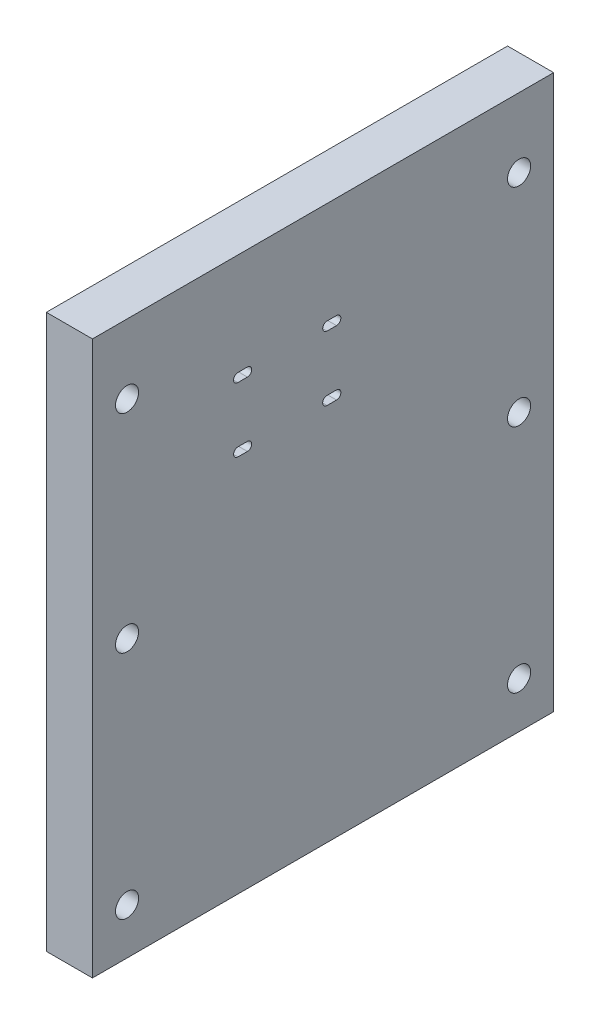
ISO-10303-21;
HEADER;
FILE_DESCRIPTION(('STEP AP214'),'2;1');
FILE_NAME('part.step','',(''),(''),'','','');
FILE_SCHEMA(('AUTOMOTIVE_DESIGN { 1 0 10303 214 1 1 1 1 }'));
ENDSEC;
DATA;
#1=APPLICATION_CONTEXT('core data for automotive mechanical design processes');
#2=APPLICATION_PROTOCOL_DEFINITION('international standard','automotive_design',2000,#1);
#3=PRODUCT_CONTEXT('',#1,'mechanical');
#4=PRODUCT('Part','Part','',(#3));
#5=PRODUCT_RELATED_PRODUCT_CATEGORY('part','',(#4));
#6=PRODUCT_DEFINITION_FORMATION('','',#4);
#7=PRODUCT_DEFINITION_CONTEXT('part definition',#1,'design');
#8=PRODUCT_DEFINITION('design','',#6,#7);
#9=PRODUCT_DEFINITION_SHAPE('','',#8);
#10=(LENGTH_UNIT() NAMED_UNIT(*) SI_UNIT(.MILLI.,.METRE.));
#11=(NAMED_UNIT(*) PLANE_ANGLE_UNIT() SI_UNIT($,.RADIAN.));
#12=(NAMED_UNIT(*) SI_UNIT($,.STERADIAN.) SOLID_ANGLE_UNIT());
#13=UNCERTAINTY_MEASURE_WITH_UNIT(LENGTH_MEASURE(1.E-05),#10,'distance_accuracy_value','');
#14=(GEOMETRIC_REPRESENTATION_CONTEXT(3) GLOBAL_UNCERTAINTY_ASSIGNED_CONTEXT((#13)) GLOBAL_UNIT_ASSIGNED_CONTEXT((#10,
#11,#12)) REPRESENTATION_CONTEXT('',''));
#15=CARTESIAN_POINT('',(0.,0.,0.));
#16=DIRECTION('',(0.,0.,1.));
#17=DIRECTION('',(1.,0.,0.));
#18=AXIS2_PLACEMENT_3D('',#15,#16,#17);
#19=CARTESIAN_POINT('',(12.7,46.97,-39.2012106466433));
#20=DIRECTION('',(-1.,0.,0.));
#21=DIRECTION('',(0.,0.,1.));
#22=AXIS2_PLACEMENT_3D('',#19,#20,#21);
#23=CYLINDRICAL_SURFACE('',#22,1.2);
#24=CARTESIAN_POINT('',(0.,46.97,-39.2012106466433));
#25=DIRECTION('',(1.,0.,0.));
#26=DIRECTION('',(0.,0.,-1.));
#27=AXIS2_PLACEMENT_3D('',#24,#25,#26);
#28=CIRCLE('',#27,1.2);
#29=CARTESIAN_POINT('',(0.,48.17,-39.2012106466433));
#30=VERTEX_POINT('',#29);
#31=CARTESIAN_POINT('',(0.,45.77,-39.2012106466433));
#32=VERTEX_POINT('',#31);
#33=EDGE_CURVE('E309',#30,#32,#28,.T.);
#34=ORIENTED_EDGE('',*,*,#33,.F.);
#35=DIRECTION('',(-1.,0.,0.));
#36=VECTOR('',#35,1.);
#37=CARTESIAN_POINT('',(12.7,48.17,-39.2012106466433));
#38=LINE('',#37,#36);
#39=CARTESIAN_POINT('',(12.7,48.17,-39.2012106466433));
#40=VERTEX_POINT('',#39);
#41=EDGE_CURVE('E11',#40,#30,#38,.T.);
#42=ORIENTED_EDGE('',*,*,#41,.F.);
#43=CARTESIAN_POINT('',(12.7,46.97,-39.2012106466433));
#44=DIRECTION('',(1.,0.,0.));
#45=DIRECTION('',(0.,0.,-1.));
#46=AXIS2_PLACEMENT_3D('',#43,#44,#45);
#47=CIRCLE('',#46,1.2);
#48=CARTESIAN_POINT('',(12.7,45.77,-39.2012106466433));
#49=VERTEX_POINT('',#48);
#50=EDGE_CURVE('E212',#40,#49,#47,.T.);
#51=ORIENTED_EDGE('',*,*,#50,.T.);
#52=DIRECTION('',(-1.,0.,0.));
#53=VECTOR('',#52,1.);
#54=CARTESIAN_POINT('',(12.7,45.77,-39.2012106466433));
#55=LINE('',#54,#53);
#56=EDGE_CURVE('E139',#49,#32,#55,.T.);
#57=ORIENTED_EDGE('',*,*,#56,.T.);
#58=EDGE_LOOP('',(#34,#42,#51,#57));
#59=FACE_BOUND('',#58,.T.);
#60=ADVANCED_FACE('F49',(#59),#23,.F.);
#61=CARTESIAN_POINT('',(12.7,48.17,0.));
#62=DIRECTION('',(0.,-1.,0.));
#63=DIRECTION('',(0.,0.,-1.));
#64=AXIS2_PLACEMENT_3D('',#61,#62,#63);
#65=PLANE('',#64);
#66=DIRECTION('',(0.,0.,1.));
#67=VECTOR('',#66,1.);
#68=CARTESIAN_POINT('',(0.,48.17,0.));
#69=LINE('',#68,#67);
#70=CARTESIAN_POINT('',(0.,48.17,-41.8012106466433));
#71=VERTEX_POINT('',#70);
#72=EDGE_CURVE('E203',#71,#30,#69,.T.);
#73=ORIENTED_EDGE('',*,*,#72,.F.);
#74=DIRECTION('',(-1.,0.,0.));
#75=VECTOR('',#74,1.);
#76=CARTESIAN_POINT('',(12.7,48.17,-41.8012106466433));
#77=LINE('',#76,#75);
#78=CARTESIAN_POINT('',(12.7,48.17,-41.8012106466433));
#79=VERTEX_POINT('',#78);
#80=EDGE_CURVE('E60',#79,#71,#77,.T.);
#81=ORIENTED_EDGE('',*,*,#80,.F.);
#82=DIRECTION('',(0.,0.,1.));
#83=VECTOR('',#82,1.);
#84=CARTESIAN_POINT('',(12.7,48.17,0.));
#85=LINE('',#84,#83);
#86=EDGE_CURVE('E201',#79,#40,#85,.T.);
#87=ORIENTED_EDGE('',*,*,#86,.T.);
#88=ORIENTED_EDGE('',*,*,#41,.T.);
#89=EDGE_LOOP('',(#73,#81,#87,#88));
#90=FACE_BOUND('',#89,.T.);
#91=ADVANCED_FACE('F200',(#90),#65,.T.);
#92=CARTESIAN_POINT('',(12.7,46.97,-41.8012106466433));
#93=DIRECTION('',(-1.,0.,0.));
#94=DIRECTION('',(0.,0.,1.));
#95=AXIS2_PLACEMENT_3D('',#92,#93,#94);
#96=CYLINDRICAL_SURFACE('',#95,1.2);
#97=CARTESIAN_POINT('',(0.,46.97,-41.8012106466433));
#98=DIRECTION('',(1.,0.,0.));
#99=DIRECTION('',(0.,0.,-1.));
#100=AXIS2_PLACEMENT_3D('',#97,#98,#99);
#101=CIRCLE('',#100,1.2);
#102=CARTESIAN_POINT('',(0.,45.77,-41.8012106466433));
#103=VERTEX_POINT('',#102);
#104=EDGE_CURVE('E315',#103,#71,#101,.T.);
#105=ORIENTED_EDGE('',*,*,#104,.F.);
#106=DIRECTION('',(-1.,0.,0.));
#107=VECTOR('',#106,1.);
#108=CARTESIAN_POINT('',(12.7,45.77,-41.8012106466433));
#109=LINE('',#108,#107);
#110=CARTESIAN_POINT('',(12.7,45.77,-41.8012106466433));
#111=VERTEX_POINT('',#110);
#112=EDGE_CURVE('E132',#111,#103,#109,.T.);
#113=ORIENTED_EDGE('',*,*,#112,.F.);
#114=CARTESIAN_POINT('',(12.7,46.97,-41.8012106466433));
#115=DIRECTION('',(1.,0.,0.));
#116=DIRECTION('',(0.,0.,-1.));
#117=AXIS2_PLACEMENT_3D('',#114,#115,#116);
#118=CIRCLE('',#117,1.2);
#119=EDGE_CURVE('E211',#111,#79,#118,.T.);
#120=ORIENTED_EDGE('',*,*,#119,.T.);
#121=ORIENTED_EDGE('',*,*,#80,.T.);
#122=EDGE_LOOP('',(#105,#113,#120,#121));
#123=FACE_BOUND('',#122,.T.);
#124=ADVANCED_FACE('F215',(#123),#96,.F.);
#125=CARTESIAN_POINT('',(12.7,30.43,0.));
#126=DIRECTION('',(0.,-1.,0.));
#127=DIRECTION('',(0.,0.,-1.));
#128=AXIS2_PLACEMENT_3D('',#125,#126,#127);
#129=PLANE('',#128);
#130=DIRECTION('',(0.,0.,1.));
#131=VECTOR('',#130,1.);
#132=CARTESIAN_POINT('',(0.,30.43,0.));
#133=LINE('',#132,#131);
#134=CARTESIAN_POINT('',(0.,30.43,-41.8012106466433));
#135=VERTEX_POINT('',#134);
#136=CARTESIAN_POINT('',(0.,30.43,-39.2012106466433));
#137=VERTEX_POINT('',#136);
#138=EDGE_CURVE('E293',#135,#137,#133,.T.);
#139=ORIENTED_EDGE('',*,*,#138,.F.);
#140=DIRECTION('',(-1.,0.,0.));
#141=VECTOR('',#140,1.);
#142=CARTESIAN_POINT('',(12.7,30.43,-41.8012106466433));
#143=LINE('',#142,#141);
#144=CARTESIAN_POINT('',(12.7,30.43,-41.8012106466433));
#145=VERTEX_POINT('',#144);
#146=EDGE_CURVE('E324',#145,#135,#143,.T.);
#147=ORIENTED_EDGE('',*,*,#146,.F.);
#148=DIRECTION('',(0.,0.,1.));
#149=VECTOR('',#148,1.);
#150=CARTESIAN_POINT('',(12.7,30.43,0.));
#151=LINE('',#150,#149);
#152=CARTESIAN_POINT('',(12.7,30.43,-39.2012106466433));
#153=VERTEX_POINT('',#152);
#154=EDGE_CURVE('E434',#145,#153,#151,.T.);
#155=ORIENTED_EDGE('',*,*,#154,.T.);
#156=DIRECTION('',(-1.,0.,0.));
#157=VECTOR('',#156,1.);
#158=CARTESIAN_POINT('',(12.7,30.43,-39.2012106466433));
#159=LINE('',#158,#157);
#160=EDGE_CURVE('E327',#153,#137,#159,.T.);
#161=ORIENTED_EDGE('',*,*,#160,.T.);
#162=EDGE_LOOP('',(#139,#147,#155,#161));
#163=FACE_BOUND('',#162,.T.);
#164=ADVANCED_FACE('F484',(#163),#129,.T.);
#165=CARTESIAN_POINT('',(12.7,29.23,-41.8012106466433));
#166=DIRECTION('',(-1.,0.,0.));
#167=DIRECTION('',(0.,0.,1.));
#168=AXIS2_PLACEMENT_3D('',#165,#166,#167);
#169=CYLINDRICAL_SURFACE('',#168,1.2);
#170=CARTESIAN_POINT('',(0.,29.23,-41.8012106466433));
#171=DIRECTION('',(1.,0.,0.));
#172=DIRECTION('',(0.,0.,-1.));
#173=AXIS2_PLACEMENT_3D('',#170,#171,#172);
#174=CIRCLE('',#173,1.2);
#175=CARTESIAN_POINT('',(0.,28.03,-41.8012106466433));
#176=VERTEX_POINT('',#175);
#177=EDGE_CURVE('E297',#135,#176,#174,.F.);
#178=ORIENTED_EDGE('',*,*,#177,.T.);
#179=DIRECTION('',(-1.,0.,0.));
#180=VECTOR('',#179,1.);
#181=CARTESIAN_POINT('',(12.7,28.03,-41.8012106466433));
#182=LINE('',#181,#180);
#183=CARTESIAN_POINT('',(12.7,28.03,-41.8012106466433));
#184=VERTEX_POINT('',#183);
#185=EDGE_CURVE('E335',#184,#176,#182,.T.);
#186=ORIENTED_EDGE('',*,*,#185,.F.);
#187=CARTESIAN_POINT('',(12.7,29.23,-41.8012106466433));
#188=DIRECTION('',(1.,0.,0.));
#189=DIRECTION('',(0.,0.,-1.));
#190=AXIS2_PLACEMENT_3D('',#187,#188,#189);
#191=CIRCLE('',#190,1.2);
#192=EDGE_CURVE('E438',#145,#184,#191,.F.);
#193=ORIENTED_EDGE('',*,*,#192,.F.);
#194=ORIENTED_EDGE('',*,*,#146,.T.);
#195=EDGE_LOOP('',(#178,#186,#193,#194));
#196=FACE_BOUND('',#195,.T.);
#197=ADVANCED_FACE('F480',(#196),#169,.F.);
#198=CARTESIAN_POINT('',(12.7,28.03,0.));
#199=DIRECTION('',(0.,-1.,0.));
#200=DIRECTION('',(0.,0.,-1.));
#201=AXIS2_PLACEMENT_3D('',#198,#199,#200);
#202=PLANE('',#201);
#203=DIRECTION('',(0.,0.,1.));
#204=VECTOR('',#203,1.);
#205=CARTESIAN_POINT('',(0.,28.03,0.));
#206=LINE('',#205,#204);
#207=CARTESIAN_POINT('',(0.,28.03,-39.2012106466433));
#208=VERTEX_POINT('',#207);
#209=EDGE_CURVE('E301',#176,#208,#206,.T.);
#210=ORIENTED_EDGE('',*,*,#209,.T.);
#211=DIRECTION('',(-1.,0.,0.));
#212=VECTOR('',#211,1.);
#213=CARTESIAN_POINT('',(12.7,28.03,-39.2012106466433));
#214=LINE('',#213,#212);
#215=CARTESIAN_POINT('',(12.7,28.03,-39.2012106466433));
#216=VERTEX_POINT('',#215);
#217=EDGE_CURVE('E330',#216,#208,#214,.T.);
#218=ORIENTED_EDGE('',*,*,#217,.F.);
#219=DIRECTION('',(0.,0.,1.));
#220=VECTOR('',#219,1.);
#221=CARTESIAN_POINT('',(12.7,28.03,0.));
#222=LINE('',#221,#220);
#223=EDGE_CURVE('E442',#184,#216,#222,.T.);
#224=ORIENTED_EDGE('',*,*,#223,.F.);
#225=ORIENTED_EDGE('',*,*,#185,.T.);
#226=EDGE_LOOP('',(#210,#218,#224,#225));
#227=FACE_BOUND('',#226,.T.);
#228=ADVANCED_FACE('F476',(#227),#202,.F.);
#229=CARTESIAN_POINT('',(12.7,45.77,0.));
#230=DIRECTION('',(0.,1.,0.));
#231=DIRECTION('',(0.,0.,1.));
#232=AXIS2_PLACEMENT_3D('',#229,#230,#231);
#233=PLANE('',#232);
#234=DIRECTION('',(0.,0.,-1.));
#235=VECTOR('',#234,1.);
#236=CARTESIAN_POINT('',(0.,45.77,0.));
#237=LINE('',#236,#235);
#238=CARTESIAN_POINT('',(0.,45.77,-14.6612106466434));
#239=VERTEX_POINT('',#238);
#240=CARTESIAN_POINT('',(0.,45.77,-17.2612106466434));
#241=VERTEX_POINT('',#240);
#242=EDGE_CURVE('E277',#239,#241,#237,.T.);
#243=ORIENTED_EDGE('',*,*,#242,.F.);
#244=DIRECTION('',(-1.,0.,0.));
#245=VECTOR('',#244,1.);
#246=CARTESIAN_POINT('',(12.7,45.77,-14.6612106466434));
#247=LINE('',#246,#245);
#248=CARTESIAN_POINT('',(12.7,45.77,-14.6612106466434));
#249=VERTEX_POINT('',#248);
#250=EDGE_CURVE('E331',#249,#239,#247,.T.);
#251=ORIENTED_EDGE('',*,*,#250,.F.);
#252=DIRECTION('',(0.,0.,-1.));
#253=VECTOR('',#252,1.);
#254=CARTESIAN_POINT('',(12.7,45.77,0.));
#255=LINE('',#254,#253);
#256=CARTESIAN_POINT('',(12.7,45.77,-17.2612106466434));
#257=VERTEX_POINT('',#256);
#258=EDGE_CURVE('E419',#249,#257,#255,.T.);
#259=ORIENTED_EDGE('',*,*,#258,.T.);
#260=DIRECTION('',(-1.,0.,0.));
#261=VECTOR('',#260,1.);
#262=CARTESIAN_POINT('',(12.7,45.77,-17.2612106466434));
#263=LINE('',#262,#261);
#264=EDGE_CURVE('E341',#257,#241,#263,.T.);
#265=ORIENTED_EDGE('',*,*,#264,.T.);
#266=EDGE_LOOP('',(#243,#251,#259,#265));
#267=FACE_BOUND('',#266,.T.);
#268=ADVANCED_FACE('F479',(#267),#233,.T.);
#269=CARTESIAN_POINT('',(12.7,46.97,-14.6612106466434));
#270=DIRECTION('',(-1.,0.,0.));
#271=DIRECTION('',(0.,0.,1.));
#272=AXIS2_PLACEMENT_3D('',#269,#270,#271);
#273=CYLINDRICAL_SURFACE('',#272,1.2);
#274=CARTESIAN_POINT('',(0.,46.97,-14.6612106466434));
#275=DIRECTION('',(1.,0.,0.));
#276=DIRECTION('',(0.,0.,-1.));
#277=AXIS2_PLACEMENT_3D('',#274,#275,#276);
#278=CIRCLE('',#277,1.2);
#279=CARTESIAN_POINT('',(0.,48.17,-14.6612106466434));
#280=VERTEX_POINT('',#279);
#281=EDGE_CURVE('E281',#239,#280,#278,.F.);
#282=ORIENTED_EDGE('',*,*,#281,.T.);
#283=DIRECTION('',(-1.,0.,0.));
#284=VECTOR('',#283,1.);
#285=CARTESIAN_POINT('',(12.7,48.17,-14.6612106466434));
#286=LINE('',#285,#284);
#287=CARTESIAN_POINT('',(12.7,48.17,-14.6612106466434));
#288=VERTEX_POINT('',#287);
#289=EDGE_CURVE('E349',#288,#280,#286,.T.);
#290=ORIENTED_EDGE('',*,*,#289,.F.);
#291=CARTESIAN_POINT('',(12.7,46.97,-14.6612106466434));
#292=DIRECTION('',(1.,0.,0.));
#293=DIRECTION('',(0.,0.,-1.));
#294=AXIS2_PLACEMENT_3D('',#291,#292,#293);
#295=CIRCLE('',#294,1.2);
#296=EDGE_CURVE('E423',#249,#288,#295,.F.);
#297=ORIENTED_EDGE('',*,*,#296,.F.);
#298=ORIENTED_EDGE('',*,*,#250,.T.);
#299=EDGE_LOOP('',(#282,#290,#297,#298));
#300=FACE_BOUND('',#299,.T.);
#301=ADVANCED_FACE('F497',(#300),#273,.F.);
#302=CARTESIAN_POINT('',(12.7,48.17,0.));
#303=DIRECTION('',(0.,1.,0.));
#304=DIRECTION('',(0.,0.,1.));
#305=AXIS2_PLACEMENT_3D('',#302,#303,#304);
#306=PLANE('',#305);
#307=DIRECTION('',(0.,0.,-1.));
#308=VECTOR('',#307,1.);
#309=CARTESIAN_POINT('',(0.,48.17,0.));
#310=LINE('',#309,#308);
#311=CARTESIAN_POINT('',(0.,48.17,-17.2612106466434));
#312=VERTEX_POINT('',#311);
#313=EDGE_CURVE('E285',#280,#312,#310,.T.);
#314=ORIENTED_EDGE('',*,*,#313,.T.);
#315=DIRECTION('',(-1.,0.,0.));
#316=VECTOR('',#315,1.);
#317=CARTESIAN_POINT('',(12.7,48.17,-17.2612106466434));
#318=LINE('',#317,#316);
#319=CARTESIAN_POINT('',(12.7,48.17,-17.2612106466434));
#320=VERTEX_POINT('',#319);
#321=EDGE_CURVE('E344',#320,#312,#318,.T.);
#322=ORIENTED_EDGE('',*,*,#321,.F.);
#323=DIRECTION('',(0.,0.,-1.));
#324=VECTOR('',#323,1.);
#325=CARTESIAN_POINT('',(12.7,48.17,0.));
#326=LINE('',#325,#324);
#327=EDGE_CURVE('E427',#288,#320,#326,.T.);
#328=ORIENTED_EDGE('',*,*,#327,.F.);
#329=ORIENTED_EDGE('',*,*,#289,.T.);
#330=EDGE_LOOP('',(#314,#322,#328,#329));
#331=FACE_BOUND('',#330,.T.);
#332=ADVANCED_FACE('F493',(#331),#306,.F.);
#333=CARTESIAN_POINT('',(12.7,29.23,-17.2612106466435));
#334=DIRECTION('',(-1.,0.,0.));
#335=DIRECTION('',(0.,0.,1.));
#336=AXIS2_PLACEMENT_3D('',#333,#334,#335);
#337=CYLINDRICAL_SURFACE('',#336,1.2);
#338=CARTESIAN_POINT('',(0.,29.23,-17.2612106466435));
#339=DIRECTION('',(1.,0.,0.));
#340=DIRECTION('',(0.,0.,-1.));
#341=AXIS2_PLACEMENT_3D('',#338,#339,#340);
#342=CIRCLE('',#341,1.2);
#343=CARTESIAN_POINT('',(0.,28.03,-17.2612106466434));
#344=VERTEX_POINT('',#343);
#345=CARTESIAN_POINT('',(0.,30.43,-17.2612106466434));
#346=VERTEX_POINT('',#345);
#347=EDGE_CURVE('E261',#344,#346,#342,.T.);
#348=ORIENTED_EDGE('',*,*,#347,.F.);
#349=DIRECTION('',(-1.,0.,0.));
#350=VECTOR('',#349,1.);
#351=CARTESIAN_POINT('',(12.7,28.03,-17.2612106466434));
#352=LINE('',#351,#350);
#353=CARTESIAN_POINT('',(12.7,28.03,-17.2612106466434));
#354=VERTEX_POINT('',#353);
#355=EDGE_CURVE('E345',#354,#344,#352,.T.);
#356=ORIENTED_EDGE('',*,*,#355,.F.);
#357=CARTESIAN_POINT('',(12.7,29.23,-17.2612106466435));
#358=DIRECTION('',(1.,0.,0.));
#359=DIRECTION('',(0.,0.,-1.));
#360=AXIS2_PLACEMENT_3D('',#357,#358,#359);
#361=CIRCLE('',#360,1.2);
#362=CARTESIAN_POINT('',(12.7,30.43,-17.2612106466434));
#363=VERTEX_POINT('',#362);
#364=EDGE_CURVE('E398',#354,#363,#361,.T.);
#365=ORIENTED_EDGE('',*,*,#364,.T.);
#366=DIRECTION('',(-1.,0.,0.));
#367=VECTOR('',#366,1.);
#368=CARTESIAN_POINT('',(12.7,30.43,-17.2612106466434));
#369=LINE('',#368,#367);
#370=EDGE_CURVE('E355',#363,#346,#369,.T.);
#371=ORIENTED_EDGE('',*,*,#370,.T.);
#372=EDGE_LOOP('',(#348,#356,#365,#371));
#373=FACE_BOUND('',#372,.T.);
#374=ADVANCED_FACE('F496',(#373),#337,.F.);
#375=CARTESIAN_POINT('',(12.7,28.03,0.));
#376=DIRECTION('',(0.,1.,0.));
#377=DIRECTION('',(0.,0.,1.));
#378=AXIS2_PLACEMENT_3D('',#375,#376,#377);
#379=PLANE('',#378);
#380=DIRECTION('',(0.,0.,-1.));
#381=VECTOR('',#380,1.);
#382=CARTESIAN_POINT('',(0.,28.03,0.));
#383=LINE('',#382,#381);
#384=CARTESIAN_POINT('',(0.,28.03,-14.6612106466434));
#385=VERTEX_POINT('',#384);
#386=EDGE_CURVE('E265',#385,#344,#383,.T.);
#387=ORIENTED_EDGE('',*,*,#386,.F.);
#388=DIRECTION('',(-1.,0.,0.));
#389=VECTOR('',#388,1.);
#390=CARTESIAN_POINT('',(12.7,28.03,-14.6612106466434));
#391=LINE('',#390,#389);
#392=CARTESIAN_POINT('',(12.7,28.03,-14.6612106466434));
#393=VERTEX_POINT('',#392);
#394=EDGE_CURVE('E361',#393,#385,#391,.T.);
#395=ORIENTED_EDGE('',*,*,#394,.F.);
#396=DIRECTION('',(0.,0.,-1.));
#397=VECTOR('',#396,1.);
#398=CARTESIAN_POINT('',(12.7,28.03,0.));
#399=LINE('',#398,#397);
#400=EDGE_CURVE('E404',#393,#354,#399,.T.);
#401=ORIENTED_EDGE('',*,*,#400,.T.);
#402=ORIENTED_EDGE('',*,*,#355,.T.);
#403=EDGE_LOOP('',(#387,#395,#401,#402));
#404=FACE_BOUND('',#403,.T.);
#405=ADVANCED_FACE('F511',(#404),#379,.T.);
#406=CARTESIAN_POINT('',(12.7,29.23,-14.6612106466434));
#407=DIRECTION('',(-1.,0.,0.));
#408=DIRECTION('',(0.,0.,1.));
#409=AXIS2_PLACEMENT_3D('',#406,#407,#408);
#410=CYLINDRICAL_SURFACE('',#409,1.2);
#411=CARTESIAN_POINT('',(0.,29.23,-14.6612106466434));
#412=DIRECTION('',(1.,0.,0.));
#413=DIRECTION('',(0.,0.,-1.));
#414=AXIS2_PLACEMENT_3D('',#411,#412,#413);
#415=CIRCLE('',#414,1.2);
#416=CARTESIAN_POINT('',(0.,30.43,-14.6612106466434));
#417=VERTEX_POINT('',#416);
#418=EDGE_CURVE('E269',#417,#385,#415,.T.);
#419=ORIENTED_EDGE('',*,*,#418,.F.);
#420=DIRECTION('',(-1.,0.,0.));
#421=VECTOR('',#420,1.);
#422=CARTESIAN_POINT('',(12.7,30.43,-14.6612106466434));
#423=LINE('',#422,#421);
#424=CARTESIAN_POINT('',(12.7,30.43,-14.6612106466434));
#425=VERTEX_POINT('',#424);
#426=EDGE_CURVE('E358',#425,#417,#423,.T.);
#427=ORIENTED_EDGE('',*,*,#426,.F.);
#428=CARTESIAN_POINT('',(12.7,29.23,-14.6612106466434));
#429=DIRECTION('',(1.,0.,0.));
#430=DIRECTION('',(0.,0.,-1.));
#431=AXIS2_PLACEMENT_3D('',#428,#429,#430);
#432=CIRCLE('',#431,1.2);
#433=EDGE_CURVE('E412',#425,#393,#432,.T.);
#434=ORIENTED_EDGE('',*,*,#433,.T.);
#435=ORIENTED_EDGE('',*,*,#394,.T.);
#436=EDGE_LOOP('',(#419,#427,#434,#435));
#437=FACE_BOUND('',#436,.T.);
#438=ADVANCED_FACE('F508',(#437),#410,.F.);
#439=CARTESIAN_POINT('',(12.7,0.,-101.6));
#440=DIRECTION('',(0.,0.,1.));
#441=DIRECTION('',(1.,0.,0.));
#442=AXIS2_PLACEMENT_3D('',#439,#440,#441);
#443=PLANE('',#442);
#444=DIRECTION('',(0.,1.,0.));
#445=VECTOR('',#444,1.);
#446=CARTESIAN_POINT('',(0.,0.,-101.6));
#447=LINE('',#446,#445);
#448=CARTESIAN_POINT('',(0.,-76.2,-101.6));
#449=VERTEX_POINT('',#448);
#450=CARTESIAN_POINT('',(0.,76.2,-101.6));
#451=VERTEX_POINT('',#450);
#452=EDGE_CURVE('E247',#449,#451,#447,.T.);
#453=ORIENTED_EDGE('',*,*,#452,.T.);
#454=DIRECTION('',(-1.,0.,0.));
#455=VECTOR('',#454,1.);
#456=CARTESIAN_POINT('',(12.7,76.2,-101.6));
#457=LINE('',#456,#455);
#458=CARTESIAN_POINT('',(12.7,76.2,-101.6));
#459=VERTEX_POINT('',#458);
#460=EDGE_CURVE('E53',#459,#451,#457,.T.);
#461=ORIENTED_EDGE('',*,*,#460,.F.);
#462=DIRECTION('',(0.,1.,0.));
#463=VECTOR('',#462,1.);
#464=CARTESIAN_POINT('',(12.7,0.,-101.6));
#465=LINE('',#464,#463);
#466=CARTESIAN_POINT('',(12.7,-76.2,-101.6));
#467=VERTEX_POINT('',#466);
#468=EDGE_CURVE('E147',#467,#459,#465,.T.);
#469=ORIENTED_EDGE('',*,*,#468,.F.);
#470=DIRECTION('',(-1.,0.,0.));
#471=VECTOR('',#470,1.);
#472=CARTESIAN_POINT('',(12.7,-76.2,-101.6));
#473=LINE('',#472,#471);
#474=EDGE_CURVE('E219',#467,#449,#473,.T.);
#475=ORIENTED_EDGE('',*,*,#474,.T.);
#476=EDGE_LOOP('',(#453,#461,#469,#475));
#477=FACE_BOUND('',#476,.T.);
#478=ADVANCED_FACE('F385',(#477),#443,.F.);
#479=CARTESIAN_POINT('',(12.7,76.2,0.));
#480=DIRECTION('',(0.,1.,0.));
#481=DIRECTION('',(0.,0.,1.));
#482=AXIS2_PLACEMENT_3D('',#479,#480,#481);
#483=PLANE('',#482);
#484=DIRECTION('',(0.,0.,-1.));
#485=VECTOR('',#484,1.);
#486=CARTESIAN_POINT('',(0.,76.2,0.));
#487=LINE('',#486,#485);
#488=CARTESIAN_POINT('',(0.,76.2,25.4));
#489=VERTEX_POINT('',#488);
#490=EDGE_CURVE('E251',#489,#451,#487,.T.);
#491=ORIENTED_EDGE('',*,*,#490,.F.);
#492=DIRECTION('',(-1.,0.,0.));
#493=VECTOR('',#492,1.);
#494=CARTESIAN_POINT('',(12.7,76.2,25.4));
#495=LINE('',#494,#493);
#496=CARTESIAN_POINT('',(12.7,76.2,25.4));
#497=VERTEX_POINT('',#496);
#498=EDGE_CURVE('E372',#497,#489,#495,.T.);
#499=ORIENTED_EDGE('',*,*,#498,.F.);
#500=DIRECTION('',(0.,0.,-1.));
#501=VECTOR('',#500,1.);
#502=CARTESIAN_POINT('',(12.7,76.2,0.));
#503=LINE('',#502,#501);
#504=EDGE_CURVE('E382',#497,#459,#503,.T.);
#505=ORIENTED_EDGE('',*,*,#504,.T.);
#506=ORIENTED_EDGE('',*,*,#460,.T.);
#507=EDGE_LOOP('',(#491,#499,#505,#506));
#508=FACE_BOUND('',#507,.T.);
#509=ADVANCED_FACE('F381',(#508),#483,.T.);
#510=CARTESIAN_POINT('',(12.7,0.,25.4));
#511=DIRECTION('',(0.,0.,-1.));
#512=DIRECTION('',(-1.,0.,0.));
#513=AXIS2_PLACEMENT_3D('',#510,#511,#512);
#514=PLANE('',#513);
#515=DIRECTION('',(0.,-1.,0.));
#516=VECTOR('',#515,1.);
#517=CARTESIAN_POINT('',(0.,0.,25.4));
#518=LINE('',#517,#516);
#519=CARTESIAN_POINT('',(0.,-76.2,25.4));
#520=VERTEX_POINT('',#519);
#521=EDGE_CURVE('E255',#489,#520,#518,.T.);
#522=ORIENTED_EDGE('',*,*,#521,.T.);
#523=DIRECTION('',(-1.,0.,0.));
#524=VECTOR('',#523,1.);
#525=CARTESIAN_POINT('',(12.7,-76.2,25.4));
#526=LINE('',#525,#524);
#527=CARTESIAN_POINT('',(12.7,-76.2,25.4));
#528=VERTEX_POINT('',#527);
#529=EDGE_CURVE('E369',#528,#520,#526,.T.);
#530=ORIENTED_EDGE('',*,*,#529,.F.);
#531=DIRECTION('',(0.,-1.,0.));
#532=VECTOR('',#531,1.);
#533=CARTESIAN_POINT('',(12.7,0.,25.4));
#534=LINE('',#533,#532);
#535=EDGE_CURVE('E399',#497,#528,#534,.T.);
#536=ORIENTED_EDGE('',*,*,#535,.F.);
#537=ORIENTED_EDGE('',*,*,#498,.T.);
#538=EDGE_LOOP('',(#522,#530,#536,#537));
#539=FACE_BOUND('',#538,.T.);
#540=ADVANCED_FACE('F392',(#539),#514,.F.);
#541=CARTESIAN_POINT('',(12.7,29.23,-39.2012106466432));
#542=DIRECTION('',(-1.,0.,0.));
#543=DIRECTION('',(0.,0.,1.));
#544=AXIS2_PLACEMENT_3D('',#541,#542,#543);
#545=CYLINDRICAL_SURFACE('',#544,1.2);
#546=CARTESIAN_POINT('',(0.,29.23,-39.2012106466432));
#547=DIRECTION('',(1.,0.,0.));
#548=DIRECTION('',(0.,0.,-1.));
#549=AXIS2_PLACEMENT_3D('',#546,#547,#548);
#550=CIRCLE('',#549,1.2);
#551=EDGE_CURVE('E305',#208,#137,#550,.F.);
#552=ORIENTED_EDGE('',*,*,#551,.T.);
#553=ORIENTED_EDGE('',*,*,#160,.F.);
#554=CARTESIAN_POINT('',(12.7,29.23,-39.2012106466432));
#555=DIRECTION('',(1.,0.,0.));
#556=DIRECTION('',(0.,0.,-1.));
#557=AXIS2_PLACEMENT_3D('',#554,#555,#556);
#558=CIRCLE('',#557,1.2);
#559=EDGE_CURVE('E446',#216,#153,#558,.F.);
#560=ORIENTED_EDGE('',*,*,#559,.F.);
#561=ORIENTED_EDGE('',*,*,#217,.T.);
#562=EDGE_LOOP('',(#552,#553,#560,#561));
#563=FACE_BOUND('',#562,.T.);
#564=ADVANCED_FACE('F471',(#563),#545,.F.);
#565=CARTESIAN_POINT('',(12.7,46.97,-17.2612106466434));
#566=DIRECTION('',(-1.,0.,0.));
#567=DIRECTION('',(0.,0.,1.));
#568=AXIS2_PLACEMENT_3D('',#565,#566,#567);
#569=CYLINDRICAL_SURFACE('',#568,1.2);
#570=CARTESIAN_POINT('',(0.,46.97,-17.2612106466434));
#571=DIRECTION('',(1.,0.,0.));
#572=DIRECTION('',(0.,0.,-1.));
#573=AXIS2_PLACEMENT_3D('',#570,#571,#572);
#574=CIRCLE('',#573,1.2);
#575=EDGE_CURVE('E289',#312,#241,#574,.F.);
#576=ORIENTED_EDGE('',*,*,#575,.T.);
#577=ORIENTED_EDGE('',*,*,#264,.F.);
#578=CARTESIAN_POINT('',(12.7,46.97,-17.2612106466434));
#579=DIRECTION('',(1.,0.,0.));
#580=DIRECTION('',(0.,0.,-1.));
#581=AXIS2_PLACEMENT_3D('',#578,#579,#580);
#582=CIRCLE('',#581,1.2);
#583=EDGE_CURVE('E431',#320,#257,#582,.F.);
#584=ORIENTED_EDGE('',*,*,#583,.F.);
#585=ORIENTED_EDGE('',*,*,#321,.T.);
#586=EDGE_LOOP('',(#576,#577,#584,#585));
#587=FACE_BOUND('',#586,.T.);
#588=ADVANCED_FACE('F474',(#587),#569,.F.);
#589=CARTESIAN_POINT('',(12.7,30.43,0.));
#590=DIRECTION('',(0.,1.,0.));
#591=DIRECTION('',(0.,0.,1.));
#592=AXIS2_PLACEMENT_3D('',#589,#590,#591);
#593=PLANE('',#592);
#594=DIRECTION('',(0.,0.,-1.));
#595=VECTOR('',#594,1.);
#596=CARTESIAN_POINT('',(0.,30.43,0.));
#597=LINE('',#596,#595);
#598=EDGE_CURVE('E273',#417,#346,#597,.T.);
#599=ORIENTED_EDGE('',*,*,#598,.T.);
#600=ORIENTED_EDGE('',*,*,#370,.F.);
#601=DIRECTION('',(0.,0.,-1.));
#602=VECTOR('',#601,1.);
#603=CARTESIAN_POINT('',(12.7,30.43,0.));
#604=LINE('',#603,#602);
#605=EDGE_CURVE('E416',#425,#363,#604,.T.);
#606=ORIENTED_EDGE('',*,*,#605,.F.);
#607=ORIENTED_EDGE('',*,*,#426,.T.);
#608=EDGE_LOOP('',(#599,#600,#606,#607));
#609=FACE_BOUND('',#608,.T.);
#610=ADVANCED_FACE('F491',(#609),#593,.F.);
#611=CARTESIAN_POINT('',(12.7,-76.2,0.));
#612=DIRECTION('',(0.,1.,0.));
#613=DIRECTION('',(0.,0.,1.));
#614=AXIS2_PLACEMENT_3D('',#611,#612,#613);
#615=PLANE('',#614);
#616=DIRECTION('',(0.,0.,-1.));
#617=VECTOR('',#616,1.);
#618=CARTESIAN_POINT('',(0.,-76.2,0.));
#619=LINE('',#618,#617);
#620=EDGE_CURVE('E258',#520,#449,#619,.T.);
#621=ORIENTED_EDGE('',*,*,#620,.T.);
#622=ORIENTED_EDGE('',*,*,#474,.F.);
#623=DIRECTION('',(0.,0.,-1.));
#624=VECTOR('',#623,1.);
#625=CARTESIAN_POINT('',(12.7,-76.2,0.));
#626=LINE('',#625,#624);
#627=EDGE_CURVE('E396',#528,#467,#626,.T.);
#628=ORIENTED_EDGE('',*,*,#627,.F.);
#629=ORIENTED_EDGE('',*,*,#529,.T.);
#630=EDGE_LOOP('',(#621,#622,#628,#629));
#631=FACE_BOUND('',#630,.T.);
#632=ADVANCED_FACE('F395',(#631),#615,.F.);
#633=CARTESIAN_POINT('',(12.7,-63.5,15.875));
#634=DIRECTION('',(-1.,0.,0.));
#635=DIRECTION('',(0.,0.,1.));
#636=AXIS2_PLACEMENT_3D('',#633,#634,#635);
#637=CYLINDRICAL_SURFACE('',#636,3.175);
#638=CARTESIAN_POINT('',(12.7,-63.5,15.875));
#639=DIRECTION('',(1.,0.,0.));
#640=DIRECTION('',(0.,0.,-1.));
#641=AXIS2_PLACEMENT_3D('',#638,#639,#640);
#642=CIRCLE('',#641,3.175);
#643=CARTESIAN_POINT('',(12.7,-63.5,12.7));
#644=VERTEX_POINT('',#643);
#645=EDGE_CURVE('E806',#644,#644,#642,.T.);
#646=ORIENTED_EDGE('',*,*,#645,.T.);
#647=EDGE_LOOP('',(#646));
#648=FACE_BOUND('',#647,.T.);
#649=CARTESIAN_POINT('',(0.,-63.5,15.875));
#650=DIRECTION('',(1.,0.,0.));
#651=DIRECTION('',(0.,0.,-1.));
#652=AXIS2_PLACEMENT_3D('',#649,#650,#651);
#653=CIRCLE('',#652,3.175);
#654=CARTESIAN_POINT('',(0.,-63.5,12.7));
#655=VERTEX_POINT('',#654);
#656=EDGE_CURVE('E243',#655,#655,#653,.T.);
#657=ORIENTED_EDGE('',*,*,#656,.F.);
#658=EDGE_LOOP('',(#657));
#659=FACE_BOUND('',#658,.T.);
#660=ADVANCED_FACE('F521',(#648,#659),#637,.F.);
#661=CARTESIAN_POINT('',(12.7,-63.5,-92.075));
#662=DIRECTION('',(-1.,0.,0.));
#663=DIRECTION('',(0.,0.,1.));
#664=AXIS2_PLACEMENT_3D('',#661,#662,#663);
#665=CYLINDRICAL_SURFACE('',#664,3.175);
#666=CARTESIAN_POINT('',(12.7,-63.5,-92.075));
#667=DIRECTION('',(1.,0.,0.));
#668=DIRECTION('',(0.,0.,-1.));
#669=AXIS2_PLACEMENT_3D('',#666,#667,#668);
#670=CIRCLE('',#669,3.175);
#671=CARTESIAN_POINT('',(12.7,-63.5,-95.25));
#672=VERTEX_POINT('',#671);
#673=EDGE_CURVE('E802',#672,#672,#670,.T.);
#674=ORIENTED_EDGE('',*,*,#673,.T.);
#675=EDGE_LOOP('',(#674));
#676=FACE_BOUND('',#675,.T.);
#677=CARTESIAN_POINT('',(0.,-63.5,-92.075));
#678=DIRECTION('',(1.,0.,0.));
#679=DIRECTION('',(0.,0.,-1.));
#680=AXIS2_PLACEMENT_3D('',#677,#678,#679);
#681=CIRCLE('',#680,3.175);
#682=CARTESIAN_POINT('',(0.,-63.5,-95.25));
#683=VERTEX_POINT('',#682);
#684=EDGE_CURVE('E239',#683,#683,#681,.T.);
#685=ORIENTED_EDGE('',*,*,#684,.F.);
#686=EDGE_LOOP('',(#685));
#687=FACE_BOUND('',#686,.T.);
#688=ADVANCED_FACE('F530',(#676,#687),#665,.F.);
#689=CARTESIAN_POINT('',(12.7,0.,15.875));
#690=DIRECTION('',(-1.,0.,0.));
#691=DIRECTION('',(0.,0.,1.));
#692=AXIS2_PLACEMENT_3D('',#689,#690,#691);
#693=CYLINDRICAL_SURFACE('',#692,3.175);
#694=CARTESIAN_POINT('',(12.7,0.,15.875));
#695=DIRECTION('',(1.,0.,0.));
#696=DIRECTION('',(0.,0.,-1.));
#697=AXIS2_PLACEMENT_3D('',#694,#695,#696);
#698=CIRCLE('',#697,3.175);
#699=CARTESIAN_POINT('',(12.7,0.,12.7));
#700=VERTEX_POINT('',#699);
#701=EDGE_CURVE('E794',#700,#700,#698,.T.);
#702=ORIENTED_EDGE('',*,*,#701,.T.);
#703=EDGE_LOOP('',(#702));
#704=FACE_BOUND('',#703,.T.);
#705=CARTESIAN_POINT('',(0.,0.,15.875));
#706=DIRECTION('',(1.,0.,0.));
#707=DIRECTION('',(0.,0.,-1.));
#708=AXIS2_PLACEMENT_3D('',#705,#706,#707);
#709=CIRCLE('',#708,3.175);
#710=CARTESIAN_POINT('',(0.,0.,12.7));
#711=VERTEX_POINT('',#710);
#712=EDGE_CURVE('E235',#711,#711,#709,.T.);
#713=ORIENTED_EDGE('',*,*,#712,.F.);
#714=EDGE_LOOP('',(#713));
#715=FACE_BOUND('',#714,.T.);
#716=ADVANCED_FACE('F534',(#704,#715),#693,.F.);
#717=CARTESIAN_POINT('',(12.7,57.15,15.875));
#718=DIRECTION('',(-1.,0.,0.));
#719=DIRECTION('',(0.,0.,1.));
#720=AXIS2_PLACEMENT_3D('',#717,#718,#719);
#721=CYLINDRICAL_SURFACE('',#720,3.175);
#722=CARTESIAN_POINT('',(12.7,57.15,15.875));
#723=DIRECTION('',(1.,0.,0.));
#724=DIRECTION('',(0.,0.,-1.));
#725=AXIS2_PLACEMENT_3D('',#722,#723,#724);
#726=CIRCLE('',#725,3.175);
#727=CARTESIAN_POINT('',(12.7,57.15,12.7));
#728=VERTEX_POINT('',#727);
#729=EDGE_CURVE('E789',#728,#728,#726,.T.);
#730=ORIENTED_EDGE('',*,*,#729,.T.);
#731=EDGE_LOOP('',(#730));
#732=FACE_BOUND('',#731,.T.);
#733=CARTESIAN_POINT('',(0.,57.15,15.875));
#734=DIRECTION('',(1.,0.,0.));
#735=DIRECTION('',(0.,0.,-1.));
#736=AXIS2_PLACEMENT_3D('',#733,#734,#735);
#737=CIRCLE('',#736,3.175);
#738=CARTESIAN_POINT('',(0.,57.15,12.7));
#739=VERTEX_POINT('',#738);
#740=EDGE_CURVE('E231',#739,#739,#737,.T.);
#741=ORIENTED_EDGE('',*,*,#740,.F.);
#742=EDGE_LOOP('',(#741));
#743=FACE_BOUND('',#742,.T.);
#744=ADVANCED_FACE('F538',(#732,#743),#721,.F.);
#745=CARTESIAN_POINT('',(12.7,0.,-92.075));
#746=DIRECTION('',(-1.,0.,0.));
#747=DIRECTION('',(0.,0.,1.));
#748=AXIS2_PLACEMENT_3D('',#745,#746,#747);
#749=CYLINDRICAL_SURFACE('',#748,3.175);
#750=CARTESIAN_POINT('',(12.7,0.,-92.075));
#751=DIRECTION('',(1.,0.,0.));
#752=DIRECTION('',(0.,0.,-1.));
#753=AXIS2_PLACEMENT_3D('',#750,#751,#752);
#754=CIRCLE('',#753,3.175);
#755=CARTESIAN_POINT('',(12.7,0.,-95.25));
#756=VERTEX_POINT('',#755);
#757=EDGE_CURVE('E549',#756,#756,#754,.T.);
#758=ORIENTED_EDGE('',*,*,#757,.T.);
#759=EDGE_LOOP('',(#758));
#760=FACE_BOUND('',#759,.T.);
#761=CARTESIAN_POINT('',(0.,0.,-92.075));
#762=DIRECTION('',(1.,0.,0.));
#763=DIRECTION('',(0.,0.,-1.));
#764=AXIS2_PLACEMENT_3D('',#761,#762,#763);
#765=CIRCLE('',#764,3.175);
#766=CARTESIAN_POINT('',(0.,0.,-95.25));
#767=VERTEX_POINT('',#766);
#768=EDGE_CURVE('E227',#767,#767,#765,.T.);
#769=ORIENTED_EDGE('',*,*,#768,.F.);
#770=EDGE_LOOP('',(#769));
#771=FACE_BOUND('',#770,.T.);
#772=ADVANCED_FACE('F460',(#760,#771),#749,.F.);
#773=CARTESIAN_POINT('',(12.7,57.15,-92.075));
#774=DIRECTION('',(-1.,0.,0.));
#775=DIRECTION('',(0.,0.,1.));
#776=AXIS2_PLACEMENT_3D('',#773,#774,#775);
#777=CYLINDRICAL_SURFACE('',#776,3.175);
#778=CARTESIAN_POINT('',(12.7,57.15,-92.075));
#779=DIRECTION('',(1.,0.,0.));
#780=DIRECTION('',(0.,0.,-1.));
#781=AXIS2_PLACEMENT_3D('',#778,#779,#780);
#782=CIRCLE('',#781,3.175);
#783=CARTESIAN_POINT('',(12.7,57.15,-95.25));
#784=VERTEX_POINT('',#783);
#785=EDGE_CURVE('E321',#784,#784,#782,.T.);
#786=ORIENTED_EDGE('',*,*,#785,.T.);
#787=EDGE_LOOP('',(#786));
#788=FACE_BOUND('',#787,.T.);
#789=CARTESIAN_POINT('',(0.,57.15,-92.075));
#790=DIRECTION('',(1.,0.,0.));
#791=DIRECTION('',(0.,0.,-1.));
#792=AXIS2_PLACEMENT_3D('',#789,#790,#791);
#793=CIRCLE('',#792,3.175);
#794=CARTESIAN_POINT('',(0.,57.15,-95.25));
#795=VERTEX_POINT('',#794);
#796=EDGE_CURVE('E223',#795,#795,#793,.T.);
#797=ORIENTED_EDGE('',*,*,#796,.F.);
#798=EDGE_LOOP('',(#797));
#799=FACE_BOUND('',#798,.T.);
#800=ADVANCED_FACE('F51',(#788,#799),#777,.F.);
#801=CARTESIAN_POINT('',(12.7,45.77,0.));
#802=DIRECTION('',(0.,-1.,0.));
#803=DIRECTION('',(0.,0.,-1.));
#804=AXIS2_PLACEMENT_3D('',#801,#802,#803);
#805=PLANE('',#804);
#806=DIRECTION('',(0.,0.,1.));
#807=VECTOR('',#806,1.);
#808=CARTESIAN_POINT('',(0.,45.77,0.));
#809=LINE('',#808,#807);
#810=EDGE_CURVE('E318',#103,#32,#809,.T.);
#811=ORIENTED_EDGE('',*,*,#810,.T.);
#812=ORIENTED_EDGE('',*,*,#56,.F.);
#813=DIRECTION('',(0.,0.,1.));
#814=VECTOR('',#813,1.);
#815=CARTESIAN_POINT('',(12.7,45.77,0.));
#816=LINE('',#815,#814);
#817=EDGE_CURVE('E69',#111,#49,#816,.T.);
#818=ORIENTED_EDGE('',*,*,#817,.F.);
#819=ORIENTED_EDGE('',*,*,#112,.T.);
#820=EDGE_LOOP('',(#811,#812,#818,#819));
#821=FACE_BOUND('',#820,.T.);
#822=ADVANCED_FACE('F450',(#821),#805,.F.);
#823=CARTESIAN_POINT('',(12.7,0.,0.));
#824=DIRECTION('',(1.,0.,0.));
#825=DIRECTION('',(0.,0.,-1.));
#826=AXIS2_PLACEMENT_3D('',#823,#824,#825);
#827=PLANE('',#826);
#828=ORIENTED_EDGE('',*,*,#785,.F.);
#829=EDGE_LOOP('',(#828));
#830=FACE_BOUND('',#829,.T.);
#831=ORIENTED_EDGE('',*,*,#757,.F.);
#832=EDGE_LOOP('',(#831));
#833=FACE_BOUND('',#832,.T.);
#834=ORIENTED_EDGE('',*,*,#729,.F.);
#835=EDGE_LOOP('',(#834));
#836=FACE_BOUND('',#835,.T.);
#837=ORIENTED_EDGE('',*,*,#701,.F.);
#838=EDGE_LOOP('',(#837));
#839=FACE_BOUND('',#838,.T.);
#840=ORIENTED_EDGE('',*,*,#673,.F.);
#841=EDGE_LOOP('',(#840));
#842=FACE_BOUND('',#841,.T.);
#843=ORIENTED_EDGE('',*,*,#645,.F.);
#844=EDGE_LOOP('',(#843));
#845=FACE_BOUND('',#844,.T.);
#846=ORIENTED_EDGE('',*,*,#468,.T.);
#847=ORIENTED_EDGE('',*,*,#504,.F.);
#848=ORIENTED_EDGE('',*,*,#535,.T.);
#849=ORIENTED_EDGE('',*,*,#627,.T.);
#850=EDGE_LOOP('',(#846,#847,#848,#849));
#851=FACE_BOUND('',#850,.T.);
#852=ORIENTED_EDGE('',*,*,#364,.F.);
#853=ORIENTED_EDGE('',*,*,#400,.F.);
#854=ORIENTED_EDGE('',*,*,#433,.F.);
#855=ORIENTED_EDGE('',*,*,#605,.T.);
#856=EDGE_LOOP('',(#852,#853,#854,#855));
#857=FACE_BOUND('',#856,.T.);
#858=ORIENTED_EDGE('',*,*,#258,.F.);
#859=ORIENTED_EDGE('',*,*,#296,.T.);
#860=ORIENTED_EDGE('',*,*,#327,.T.);
#861=ORIENTED_EDGE('',*,*,#583,.T.);
#862=EDGE_LOOP('',(#858,#859,#860,#861));
#863=FACE_BOUND('',#862,.T.);
#864=ORIENTED_EDGE('',*,*,#154,.F.);
#865=ORIENTED_EDGE('',*,*,#192,.T.);
#866=ORIENTED_EDGE('',*,*,#223,.T.);
#867=ORIENTED_EDGE('',*,*,#559,.T.);
#868=EDGE_LOOP('',(#864,#865,#866,#867));
#869=FACE_BOUND('',#868,.T.);
#870=ORIENTED_EDGE('',*,*,#50,.F.);
#871=ORIENTED_EDGE('',*,*,#86,.F.);
#872=ORIENTED_EDGE('',*,*,#119,.F.);
#873=ORIENTED_EDGE('',*,*,#817,.T.);
#874=EDGE_LOOP('',(#870,#871,#872,#873));
#875=FACE_BOUND('',#874,.T.);
#876=ADVANCED_FACE('F210',(#830,#833,#836,#839,#842,#845,#851,#857,#863,#869,#875),#827,.T.);
#877=CARTESIAN_POINT('',(0.,0.,0.));
#878=DIRECTION('',(1.,0.,0.));
#879=DIRECTION('',(0.,0.,-1.));
#880=AXIS2_PLACEMENT_3D('',#877,#878,#879);
#881=PLANE('',#880);
#882=ORIENTED_EDGE('',*,*,#796,.T.);
#883=EDGE_LOOP('',(#882));
#884=FACE_BOUND('',#883,.T.);
#885=ORIENTED_EDGE('',*,*,#768,.T.);
#886=EDGE_LOOP('',(#885));
#887=FACE_BOUND('',#886,.T.);
#888=ORIENTED_EDGE('',*,*,#740,.T.);
#889=EDGE_LOOP('',(#888));
#890=FACE_BOUND('',#889,.T.);
#891=ORIENTED_EDGE('',*,*,#712,.T.);
#892=EDGE_LOOP('',(#891));
#893=FACE_BOUND('',#892,.T.);
#894=ORIENTED_EDGE('',*,*,#684,.T.);
#895=EDGE_LOOP('',(#894));
#896=FACE_BOUND('',#895,.T.);
#897=ORIENTED_EDGE('',*,*,#656,.T.);
#898=EDGE_LOOP('',(#897));
#899=FACE_BOUND('',#898,.T.);
#900=ORIENTED_EDGE('',*,*,#452,.F.);
#901=ORIENTED_EDGE('',*,*,#620,.F.);
#902=ORIENTED_EDGE('',*,*,#521,.F.);
#903=ORIENTED_EDGE('',*,*,#490,.T.);
#904=EDGE_LOOP('',(#900,#901,#902,#903));
#905=FACE_BOUND('',#904,.T.);
#906=ORIENTED_EDGE('',*,*,#347,.T.);
#907=ORIENTED_EDGE('',*,*,#598,.F.);
#908=ORIENTED_EDGE('',*,*,#418,.T.);
#909=ORIENTED_EDGE('',*,*,#386,.T.);
#910=EDGE_LOOP('',(#906,#907,#908,#909));
#911=FACE_BOUND('',#910,.T.);
#912=ORIENTED_EDGE('',*,*,#242,.T.);
#913=ORIENTED_EDGE('',*,*,#575,.F.);
#914=ORIENTED_EDGE('',*,*,#313,.F.);
#915=ORIENTED_EDGE('',*,*,#281,.F.);
#916=EDGE_LOOP('',(#912,#913,#914,#915));
#917=FACE_BOUND('',#916,.T.);
#918=ORIENTED_EDGE('',*,*,#138,.T.);
#919=ORIENTED_EDGE('',*,*,#551,.F.);
#920=ORIENTED_EDGE('',*,*,#209,.F.);
#921=ORIENTED_EDGE('',*,*,#177,.F.);
#922=EDGE_LOOP('',(#918,#919,#920,#921));
#923=FACE_BOUND('',#922,.T.);
#924=ORIENTED_EDGE('',*,*,#33,.T.);
#925=ORIENTED_EDGE('',*,*,#810,.F.);
#926=ORIENTED_EDGE('',*,*,#104,.T.);
#927=ORIENTED_EDGE('',*,*,#72,.T.);
#928=EDGE_LOOP('',(#924,#925,#926,#927));
#929=FACE_BOUND('',#928,.T.);
#930=ADVANCED_FACE('F389',(#884,#887,#890,#893,#896,#899,#905,#911,#917,#923,#929),#881,.F.);
#931=CLOSED_SHELL('',(#60,#91,#124,#164,#197,#228,#268,#301,#332,#374,#405,#438,#478,#509,#540,
#564,#588,#610,#632,#660,#688,#716,#744,#772,#800,#822,#876,#930));
#932=MANIFOLD_SOLID_BREP('B2',#931);
#933=ADVANCED_BREP_SHAPE_REPRESENTATION('',(#18,#932),#14);
#934=SHAPE_DEFINITION_REPRESENTATION(#9,#933);
ENDSEC;
END-ISO-10303-21;
